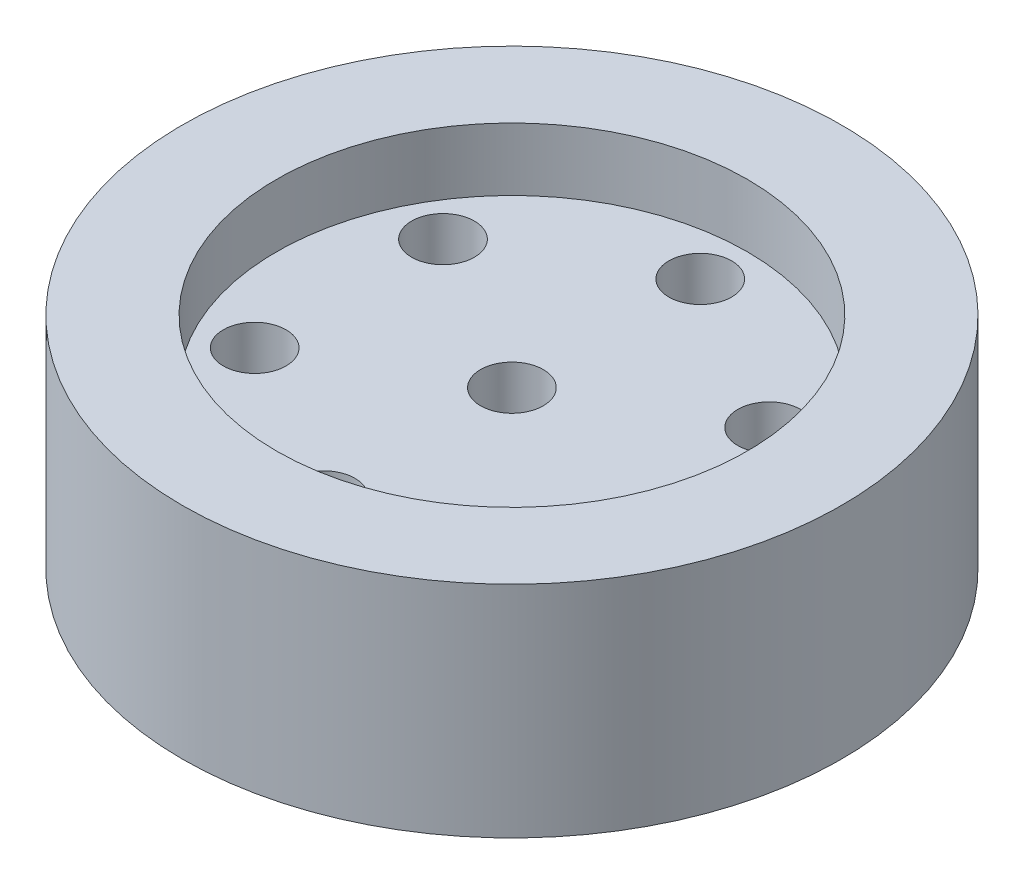
ISO-10303-21;
HEADER;
FILE_DESCRIPTION(('STEP AP214'),'2;1');
FILE_NAME('part.step','',(''),(''),'','','');
FILE_SCHEMA(('AUTOMOTIVE_DESIGN { 1 0 10303 214 1 1 1 1 }'));
ENDSEC;
DATA;
#1=APPLICATION_CONTEXT('core data for automotive mechanical design processes');
#2=APPLICATION_PROTOCOL_DEFINITION('international standard','automotive_design',2000,#1);
#3=PRODUCT_CONTEXT('',#1,'mechanical');
#4=PRODUCT('Part','Part','',(#3));
#5=PRODUCT_RELATED_PRODUCT_CATEGORY('part','',(#4));
#6=PRODUCT_DEFINITION_FORMATION('','',#4);
#7=PRODUCT_DEFINITION_CONTEXT('part definition',#1,'design');
#8=PRODUCT_DEFINITION('design','',#6,#7);
#9=PRODUCT_DEFINITION_SHAPE('','',#8);
#10=(LENGTH_UNIT() NAMED_UNIT(*) SI_UNIT(.MILLI.,.METRE.));
#11=(NAMED_UNIT(*) PLANE_ANGLE_UNIT() SI_UNIT($,.RADIAN.));
#12=(NAMED_UNIT(*) SI_UNIT($,.STERADIAN.) SOLID_ANGLE_UNIT());
#13=UNCERTAINTY_MEASURE_WITH_UNIT(LENGTH_MEASURE(1.E-05),#10,'distance_accuracy_value','');
#14=(GEOMETRIC_REPRESENTATION_CONTEXT(3) GLOBAL_UNCERTAINTY_ASSIGNED_CONTEXT((#13)) GLOBAL_UNIT_ASSIGNED_CONTEXT((#10,
#11,#12)) REPRESENTATION_CONTEXT('',''));
#15=CARTESIAN_POINT('',(0.,0.,0.));
#16=DIRECTION('',(0.,0.,1.));
#17=DIRECTION('',(1.,0.,0.));
#18=AXIS2_PLACEMENT_3D('',#15,#16,#17);
#19=CARTESIAN_POINT('',(0.,7.,0.));
#20=DIRECTION('',(0.,-1.,0.));
#21=DIRECTION('',(0.,0.,-1.));
#22=AXIS2_PLACEMENT_3D('',#19,#20,#21);
#23=CYLINDRICAL_SURFACE('',#22,21.);
#24=CARTESIAN_POINT('',(0.,7.,0.));
#25=DIRECTION('',(0.,1.,0.));
#26=DIRECTION('',(0.,0.,1.));
#27=AXIS2_PLACEMENT_3D('',#24,#25,#26);
#28=CIRCLE('',#27,21.);
#29=CARTESIAN_POINT('',(0.,7.,21.));
#30=VERTEX_POINT('',#29);
#31=EDGE_CURVE('E10',#30,#30,#28,.T.);
#32=ORIENTED_EDGE('',*,*,#31,.F.);
#33=EDGE_LOOP('',(#32));
#34=FACE_BOUND('',#33,.T.);
#35=CARTESIAN_POINT('',(0.,-7.,0.));
#36=DIRECTION('',(0.,1.,0.));
#37=DIRECTION('',(0.,0.,1.));
#38=AXIS2_PLACEMENT_3D('',#35,#36,#37);
#39=CIRCLE('',#38,21.);
#40=CARTESIAN_POINT('',(0.,-7.,21.));
#41=VERTEX_POINT('',#40);
#42=EDGE_CURVE('E38',#41,#41,#39,.T.);
#43=ORIENTED_EDGE('',*,*,#42,.T.);
#44=EDGE_LOOP('',(#43));
#45=FACE_BOUND('',#44,.T.);
#46=ADVANCED_FACE('F35',(#34,#45),#23,.T.);
#47=CARTESIAN_POINT('',(0.,7.,0.));
#48=DIRECTION('',(0.,1.,0.));
#49=DIRECTION('',(0.,0.,1.));
#50=AXIS2_PLACEMENT_3D('',#47,#48,#49);
#51=PLANE('',#50);
#52=CARTESIAN_POINT('',(0.,7.,0.));
#53=DIRECTION('',(0.,1.,0.));
#54=DIRECTION('',(0.,0.,1.));
#55=AXIS2_PLACEMENT_3D('',#52,#53,#54);
#56=CIRCLE('',#55,15.);
#57=CARTESIAN_POINT('',(0.,7.,15.));
#58=VERTEX_POINT('',#57);
#59=EDGE_CURVE('E47',#58,#58,#56,.T.);
#60=ORIENTED_EDGE('',*,*,#59,.F.);
#61=EDGE_LOOP('',(#60));
#62=FACE_BOUND('',#61,.T.);
#63=ORIENTED_EDGE('',*,*,#31,.T.);
#64=EDGE_LOOP('',(#63));
#65=FACE_BOUND('',#64,.T.);
#66=ADVANCED_FACE('F139',(#62,#65),#51,.T.);
#67=CARTESIAN_POINT('',(0.,-7.,0.));
#68=DIRECTION('',(0.,1.,0.));
#69=DIRECTION('',(0.,0.,1.));
#70=AXIS2_PLACEMENT_3D('',#67,#68,#69);
#71=PLANE('',#70);
#72=CARTESIAN_POINT('',(0.,-7.,0.));
#73=DIRECTION('',(0.,-1.,0.));
#74=DIRECTION('',(0.,0.,-1.));
#75=AXIS2_PLACEMENT_3D('',#72,#73,#74);
#76=CIRCLE('',#75,19.);
#77=CARTESIAN_POINT('',(0.,-7.,-19.));
#78=VERTEX_POINT('',#77);
#79=EDGE_CURVE('E53',#78,#78,#76,.T.);
#80=ORIENTED_EDGE('',*,*,#79,.F.);
#81=EDGE_LOOP('',(#80));
#82=FACE_BOUND('',#81,.T.);
#83=ORIENTED_EDGE('',*,*,#42,.F.);
#84=EDGE_LOOP('',(#83));
#85=FACE_BOUND('',#84,.T.);
#86=ADVANCED_FACE('F135',(#82,#85),#71,.F.);
#87=CARTESIAN_POINT('',(0.,3.,0.));
#88=DIRECTION('',(0.,1.,0.));
#89=DIRECTION('',(0.,0.,1.));
#90=AXIS2_PLACEMENT_3D('',#87,#88,#89);
#91=CYLINDRICAL_SURFACE('',#90,15.);
#92=CARTESIAN_POINT('',(0.,3.,0.));
#93=DIRECTION('',(0.,1.,0.));
#94=DIRECTION('',(0.,0.,1.));
#95=AXIS2_PLACEMENT_3D('',#92,#93,#94);
#96=CIRCLE('',#95,15.);
#97=CARTESIAN_POINT('',(0.,3.,15.));
#98=VERTEX_POINT('',#97);
#99=EDGE_CURVE('E45',#98,#98,#96,.T.);
#100=ORIENTED_EDGE('',*,*,#99,.F.);
#101=EDGE_LOOP('',(#100));
#102=FACE_BOUND('',#101,.T.);
#103=ORIENTED_EDGE('',*,*,#59,.T.);
#104=EDGE_LOOP('',(#103));
#105=FACE_BOUND('',#104,.T.);
#106=ADVANCED_FACE('F138',(#102,#105),#91,.F.);
#107=CARTESIAN_POINT('',(0.,3.,0.));
#108=DIRECTION('',(0.,1.,0.));
#109=DIRECTION('',(0.,0.,1.));
#110=AXIS2_PLACEMENT_3D('',#107,#108,#109);
#111=PLANE('',#110);
#112=CARTESIAN_POINT('',(0.,3.,12.));
#113=DIRECTION('',(0.,1.,0.));
#114=DIRECTION('',(0.,0.,1.));
#115=AXIS2_PLACEMENT_3D('',#112,#113,#114);
#116=CIRCLE('',#115,2.);
#117=CARTESIAN_POINT('',(0.,3.,14.));
#118=VERTEX_POINT('',#117);
#119=EDGE_CURVE('E70',#118,#118,#116,.T.);
#120=ORIENTED_EDGE('',*,*,#119,.F.);
#121=EDGE_LOOP('',(#120));
#122=FACE_BOUND('',#121,.T.);
#123=CARTESIAN_POINT('',(-10.3923048454131,3.,5.9999999999997));
#124=DIRECTION('',(0.,1.,0.));
#125=DIRECTION('',(0.,0.,1.));
#126=AXIS2_PLACEMENT_3D('',#123,#124,#125);
#127=CIRCLE('',#126,2.00000000000039);
#128=CARTESIAN_POINT('',(-10.3923048454131,3.,8.00000000000009));
#129=VERTEX_POINT('',#128);
#130=EDGE_CURVE('E73',#129,#129,#127,.T.);
#131=ORIENTED_EDGE('',*,*,#130,.F.);
#132=EDGE_LOOP('',(#131));
#133=FACE_BOUND('',#132,.T.);
#134=CARTESIAN_POINT('',(-10.3923048454128,3.,-6.0000000000003));
#135=DIRECTION('',(0.,1.,0.));
#136=DIRECTION('',(0.,0.,1.));
#137=AXIS2_PLACEMENT_3D('',#134,#135,#136);
#138=CIRCLE('',#137,2.00000000000068);
#139=CARTESIAN_POINT('',(-10.3923048454128,3.,-3.99999999999962));
#140=VERTEX_POINT('',#139);
#141=EDGE_CURVE('E76',#140,#140,#138,.T.);
#142=ORIENTED_EDGE('',*,*,#141,.F.);
#143=EDGE_LOOP('',(#142));
#144=FACE_BOUND('',#143,.T.);
#145=CARTESIAN_POINT('',(6.77712297852766E-13,3.,-12.));
#146=DIRECTION('',(0.,1.,0.));
#147=DIRECTION('',(0.,0.,1.));
#148=AXIS2_PLACEMENT_3D('',#145,#146,#147);
#149=CIRCLE('',#148,2.00000000000073);
#150=CARTESIAN_POINT('',(6.77712297852766E-13,3.,-9.99999999999927));
#151=VERTEX_POINT('',#150);
#152=EDGE_CURVE('E79',#151,#151,#149,.T.);
#153=ORIENTED_EDGE('',*,*,#152,.F.);
#154=EDGE_LOOP('',(#153));
#155=FACE_BOUND('',#154,.T.);
#156=CARTESIAN_POINT('',(10.3923048454138,3.,-5.99999999999971));
#157=DIRECTION('',(0.,1.,0.));
#158=DIRECTION('',(0.,0.,1.));
#159=AXIS2_PLACEMENT_3D('',#156,#157,#158);
#160=CIRCLE('',#159,2.00000000000046);
#161=CARTESIAN_POINT('',(10.3923048454138,3.,-3.99999999999925));
#162=VERTEX_POINT('',#161);
#163=EDGE_CURVE('E82',#162,#162,#160,.T.);
#164=ORIENTED_EDGE('',*,*,#163,.F.);
#165=EDGE_LOOP('',(#164));
#166=FACE_BOUND('',#165,.T.);
#167=CARTESIAN_POINT('',(10.3923048454134,3.,6.0000000000003));
#168=DIRECTION('',(0.,1.,0.));
#169=DIRECTION('',(0.,0.,1.));
#170=AXIS2_PLACEMENT_3D('',#167,#168,#169);
#171=CIRCLE('',#170,2.00000000000011);
#172=CARTESIAN_POINT('',(10.3923048454134,3.,8.00000000000041));
#173=VERTEX_POINT('',#172);
#174=EDGE_CURVE('E85',#173,#173,#171,.T.);
#175=ORIENTED_EDGE('',*,*,#174,.F.);
#176=EDGE_LOOP('',(#175));
#177=FACE_BOUND('',#176,.T.);
#178=CARTESIAN_POINT('',(0.,3.,0.));
#179=DIRECTION('',(0.,1.,0.));
#180=DIRECTION('',(0.,0.,1.));
#181=AXIS2_PLACEMENT_3D('',#178,#179,#180);
#182=CIRCLE('',#181,2.);
#183=CARTESIAN_POINT('',(0.,3.,2.));
#184=VERTEX_POINT('',#183);
#185=EDGE_CURVE('E62',#184,#184,#182,.T.);
#186=ORIENTED_EDGE('',*,*,#185,.F.);
#187=EDGE_LOOP('',(#186));
#188=FACE_BOUND('',#187,.T.);
#189=ORIENTED_EDGE('',*,*,#99,.T.);
#190=EDGE_LOOP('',(#189));
#191=FACE_BOUND('',#190,.T.);
#192=ADVANCED_FACE('F131',(#122,#133,#144,#155,#166,#177,#188,#191),#111,.T.);
#193=CARTESIAN_POINT('',(0.,-3.,0.));
#194=DIRECTION('',(0.,-1.,0.));
#195=DIRECTION('',(0.,0.,-1.));
#196=AXIS2_PLACEMENT_3D('',#193,#194,#195);
#197=CYLINDRICAL_SURFACE('',#196,19.);
#198=CARTESIAN_POINT('',(0.,-3.,0.));
#199=DIRECTION('',(0.,-1.,0.));
#200=DIRECTION('',(0.,0.,-1.));
#201=AXIS2_PLACEMENT_3D('',#198,#199,#200);
#202=CIRCLE('',#201,19.);
#203=CARTESIAN_POINT('',(0.,-3.,-19.));
#204=VERTEX_POINT('',#203);
#205=EDGE_CURVE('E50',#204,#204,#202,.T.);
#206=ORIENTED_EDGE('',*,*,#205,.F.);
#207=EDGE_LOOP('',(#206));
#208=FACE_BOUND('',#207,.T.);
#209=ORIENTED_EDGE('',*,*,#79,.T.);
#210=EDGE_LOOP('',(#209));
#211=FACE_BOUND('',#210,.T.);
#212=ADVANCED_FACE('F113',(#208,#211),#197,.F.);
#213=CARTESIAN_POINT('',(0.,-3.,0.));
#214=DIRECTION('',(0.,-1.,0.));
#215=DIRECTION('',(0.,0.,-1.));
#216=AXIS2_PLACEMENT_3D('',#213,#214,#215);
#217=PLANE('',#216);
#218=CARTESIAN_POINT('',(0.,-3.,12.));
#219=DIRECTION('',(0.,-1.,0.));
#220=DIRECTION('',(0.,0.,-1.));
#221=AXIS2_PLACEMENT_3D('',#218,#219,#220);
#222=CIRCLE('',#221,2.);
#223=CARTESIAN_POINT('',(0.,-3.,10.));
#224=VERTEX_POINT('',#223);
#225=EDGE_CURVE('E88',#224,#224,#222,.T.);
#226=ORIENTED_EDGE('',*,*,#225,.F.);
#227=EDGE_LOOP('',(#226));
#228=FACE_BOUND('',#227,.T.);
#229=CARTESIAN_POINT('',(-10.3923048454131,-3.,5.9999999999997));
#230=DIRECTION('',(0.,-1.,0.));
#231=DIRECTION('',(0.,0.,-1.));
#232=AXIS2_PLACEMENT_3D('',#229,#230,#231);
#233=CIRCLE('',#232,2.00000000000039);
#234=CARTESIAN_POINT('',(-10.3923048454131,-3.,3.99999999999931));
#235=VERTEX_POINT('',#234);
#236=EDGE_CURVE('E93',#235,#235,#233,.T.);
#237=ORIENTED_EDGE('',*,*,#236,.F.);
#238=EDGE_LOOP('',(#237));
#239=FACE_BOUND('',#238,.T.);
#240=CARTESIAN_POINT('',(-10.3923048454128,-3.,-6.0000000000003));
#241=DIRECTION('',(0.,-1.,0.));
#242=DIRECTION('',(0.,0.,-1.));
#243=AXIS2_PLACEMENT_3D('',#240,#241,#242);
#244=CIRCLE('',#243,2.00000000000068);
#245=CARTESIAN_POINT('',(-10.3923048454128,-3.,-8.00000000000098));
#246=VERTEX_POINT('',#245);
#247=EDGE_CURVE('E89',#246,#246,#244,.T.);
#248=ORIENTED_EDGE('',*,*,#247,.F.);
#249=EDGE_LOOP('',(#248));
#250=FACE_BOUND('',#249,.T.);
#251=CARTESIAN_POINT('',(6.77712297852766E-13,-3.,-12.));
#252=DIRECTION('',(0.,-1.,0.));
#253=DIRECTION('',(0.,0.,-1.));
#254=AXIS2_PLACEMENT_3D('',#251,#252,#253);
#255=CIRCLE('',#254,2.00000000000073);
#256=CARTESIAN_POINT('',(6.77712297852766E-13,-3.,-14.0000000000007));
#257=VERTEX_POINT('',#256);
#258=EDGE_CURVE('E92',#257,#257,#255,.T.);
#259=ORIENTED_EDGE('',*,*,#258,.F.);
#260=EDGE_LOOP('',(#259));
#261=FACE_BOUND('',#260,.T.);
#262=CARTESIAN_POINT('',(10.3923048454138,-3.,-5.99999999999971));
#263=DIRECTION('',(0.,-1.,0.));
#264=DIRECTION('',(0.,0.,-1.));
#265=AXIS2_PLACEMENT_3D('',#262,#263,#264);
#266=CIRCLE('',#265,2.00000000000046);
#267=CARTESIAN_POINT('',(10.3923048454138,-3.,-8.00000000000016));
#268=VERTEX_POINT('',#267);
#269=EDGE_CURVE('E96',#268,#268,#266,.T.);
#270=ORIENTED_EDGE('',*,*,#269,.F.);
#271=EDGE_LOOP('',(#270));
#272=FACE_BOUND('',#271,.T.);
#273=CARTESIAN_POINT('',(10.3923048454134,-3.,6.0000000000003));
#274=DIRECTION('',(0.,-1.,0.));
#275=DIRECTION('',(0.,0.,-1.));
#276=AXIS2_PLACEMENT_3D('',#273,#274,#275);
#277=CIRCLE('',#276,2.00000000000011);
#278=CARTESIAN_POINT('',(10.3923048454134,-3.,4.00000000000019));
#279=VERTEX_POINT('',#278);
#280=EDGE_CURVE('E99',#279,#279,#277,.T.);
#281=ORIENTED_EDGE('',*,*,#280,.F.);
#282=EDGE_LOOP('',(#281));
#283=FACE_BOUND('',#282,.T.);
#284=CARTESIAN_POINT('',(0.,-3.,0.));
#285=DIRECTION('',(0.,-1.,0.));
#286=DIRECTION('',(0.,0.,-1.));
#287=AXIS2_PLACEMENT_3D('',#284,#285,#286);
#288=CIRCLE('',#287,5.);
#289=CARTESIAN_POINT('',(0.,-3.,-5.));
#290=VERTEX_POINT('',#289);
#291=EDGE_CURVE('E56',#290,#290,#288,.T.);
#292=ORIENTED_EDGE('',*,*,#291,.F.);
#293=EDGE_LOOP('',(#292));
#294=FACE_BOUND('',#293,.T.);
#295=ORIENTED_EDGE('',*,*,#205,.T.);
#296=EDGE_LOOP('',(#295));
#297=FACE_BOUND('',#296,.T.);
#298=ADVANCED_FACE('F109',(#228,#239,#250,#261,#272,#283,#294,#297),#217,.T.);
#299=CARTESIAN_POINT('',(0.,-3.,0.));
#300=DIRECTION('',(0.,-1.,0.));
#301=DIRECTION('',(0.,0.,-1.));
#302=AXIS2_PLACEMENT_3D('',#299,#300,#301);
#303=CYLINDRICAL_SURFACE('',#302,5.);
#304=ORIENTED_EDGE('',*,*,#291,.T.);
#305=EDGE_LOOP('',(#304));
#306=FACE_BOUND('',#305,.T.);
#307=CARTESIAN_POINT('',(0.,-7.,0.));
#308=DIRECTION('',(0.,-1.,0.));
#309=DIRECTION('',(0.,0.,-1.));
#310=AXIS2_PLACEMENT_3D('',#307,#308,#309);
#311=CIRCLE('',#310,5.);
#312=CARTESIAN_POINT('',(0.,-7.,-5.));
#313=VERTEX_POINT('',#312);
#314=EDGE_CURVE('E59',#313,#313,#311,.T.);
#315=ORIENTED_EDGE('',*,*,#314,.F.);
#316=EDGE_LOOP('',(#315));
#317=FACE_BOUND('',#316,.T.);
#318=ADVANCED_FACE('F112',(#306,#317),#303,.T.);
#319=CARTESIAN_POINT('',(0.,-7.,0.));
#320=DIRECTION('',(0.,-1.,0.));
#321=DIRECTION('',(0.,0.,-1.));
#322=AXIS2_PLACEMENT_3D('',#319,#320,#321);
#323=CIRCLE('',#322,2.);
#324=CARTESIAN_POINT('',(0.,-7.,-2.));
#325=VERTEX_POINT('',#324);
#326=EDGE_CURVE('E67',#325,#325,#323,.T.);
#327=ORIENTED_EDGE('',*,*,#326,.F.);
#328=EDGE_LOOP('',(#327));
#329=FACE_BOUND('',#328,.T.);
#330=ORIENTED_EDGE('',*,*,#314,.T.);
#331=EDGE_LOOP('',(#330));
#332=FACE_BOUND('',#331,.T.);
#333=ADVANCED_FACE('F140',(#329,#332),#71,.F.);
#334=CARTESIAN_POINT('',(0.,7.,0.));
#335=DIRECTION('',(0.,-1.,0.));
#336=DIRECTION('',(0.,0.,-1.));
#337=AXIS2_PLACEMENT_3D('',#334,#335,#336);
#338=CYLINDRICAL_SURFACE('',#337,2.);
#339=ORIENTED_EDGE('',*,*,#185,.T.);
#340=EDGE_LOOP('',(#339));
#341=FACE_BOUND('',#340,.T.);
#342=ORIENTED_EDGE('',*,*,#326,.T.);
#343=EDGE_LOOP('',(#342));
#344=FACE_BOUND('',#343,.T.);
#345=ADVANCED_FACE('F163',(#341,#344),#338,.F.);
#346=CARTESIAN_POINT('',(10.3923048454134,7.,6.0000000000003));
#347=DIRECTION('',(0.,-1.,0.));
#348=DIRECTION('',(0.,0.,-1.));
#349=AXIS2_PLACEMENT_3D('',#346,#347,#348);
#350=CYLINDRICAL_SURFACE('',#349,2.00000000000011);
#351=ORIENTED_EDGE('',*,*,#174,.T.);
#352=EDGE_LOOP('',(#351));
#353=FACE_BOUND('',#352,.T.);
#354=ORIENTED_EDGE('',*,*,#280,.T.);
#355=EDGE_LOOP('',(#354));
#356=FACE_BOUND('',#355,.T.);
#357=ADVANCED_FACE('F166',(#353,#356),#350,.F.);
#358=CARTESIAN_POINT('',(10.3923048454138,7.,-5.99999999999971));
#359=DIRECTION('',(0.,-1.,0.));
#360=DIRECTION('',(0.,0.,-1.));
#361=AXIS2_PLACEMENT_3D('',#358,#359,#360);
#362=CYLINDRICAL_SURFACE('',#361,2.00000000000046);
#363=ORIENTED_EDGE('',*,*,#163,.T.);
#364=EDGE_LOOP('',(#363));
#365=FACE_BOUND('',#364,.T.);
#366=ORIENTED_EDGE('',*,*,#269,.T.);
#367=EDGE_LOOP('',(#366));
#368=FACE_BOUND('',#367,.T.);
#369=ADVANCED_FACE('F176',(#365,#368),#362,.F.);
#370=CARTESIAN_POINT('',(6.77712297852766E-13,7.,-12.));
#371=DIRECTION('',(0.,-1.,0.));
#372=DIRECTION('',(0.,0.,-1.));
#373=AXIS2_PLACEMENT_3D('',#370,#371,#372);
#374=CYLINDRICAL_SURFACE('',#373,2.00000000000073);
#375=ORIENTED_EDGE('',*,*,#152,.T.);
#376=EDGE_LOOP('',(#375));
#377=FACE_BOUND('',#376,.T.);
#378=ORIENTED_EDGE('',*,*,#258,.T.);
#379=EDGE_LOOP('',(#378));
#380=FACE_BOUND('',#379,.T.);
#381=ADVANCED_FACE('F172',(#377,#380),#374,.F.);
#382=CARTESIAN_POINT('',(-10.3923048454128,7.,-6.0000000000003));
#383=DIRECTION('',(0.,-1.,0.));
#384=DIRECTION('',(0.,0.,-1.));
#385=AXIS2_PLACEMENT_3D('',#382,#383,#384);
#386=CYLINDRICAL_SURFACE('',#385,2.00000000000068);
#387=ORIENTED_EDGE('',*,*,#141,.T.);
#388=EDGE_LOOP('',(#387));
#389=FACE_BOUND('',#388,.T.);
#390=ORIENTED_EDGE('',*,*,#247,.T.);
#391=EDGE_LOOP('',(#390));
#392=FACE_BOUND('',#391,.T.);
#393=ADVANCED_FACE('F168',(#389,#392),#386,.F.);
#394=CARTESIAN_POINT('',(-10.3923048454131,7.,5.9999999999997));
#395=DIRECTION('',(0.,-1.,0.));
#396=DIRECTION('',(0.,0.,-1.));
#397=AXIS2_PLACEMENT_3D('',#394,#395,#396);
#398=CYLINDRICAL_SURFACE('',#397,2.00000000000039);
#399=ORIENTED_EDGE('',*,*,#130,.T.);
#400=EDGE_LOOP('',(#399));
#401=FACE_BOUND('',#400,.T.);
#402=ORIENTED_EDGE('',*,*,#236,.T.);
#403=EDGE_LOOP('',(#402));
#404=FACE_BOUND('',#403,.T.);
#405=ADVANCED_FACE('F171',(#401,#404),#398,.F.);
#406=CARTESIAN_POINT('',(0.,7.,12.));
#407=DIRECTION('',(0.,-1.,0.));
#408=DIRECTION('',(0.,0.,-1.));
#409=AXIS2_PLACEMENT_3D('',#406,#407,#408);
#410=CYLINDRICAL_SURFACE('',#409,2.);
#411=ORIENTED_EDGE('',*,*,#119,.T.);
#412=EDGE_LOOP('',(#411));
#413=FACE_BOUND('',#412,.T.);
#414=ORIENTED_EDGE('',*,*,#225,.T.);
#415=EDGE_LOOP('',(#414));
#416=FACE_BOUND('',#415,.T.);
#417=ADVANCED_FACE('F107',(#413,#416),#410,.F.);
#418=CLOSED_SHELL('',(#46,#66,#86,#106,#192,#212,#298,#318,#333,#345,#357,#369,#381,#393,#405,#417));
#419=MANIFOLD_SOLID_BREP('B2',#418);
#420=ADVANCED_BREP_SHAPE_REPRESENTATION('',(#18,#419),#14);
#421=SHAPE_DEFINITION_REPRESENTATION(#9,#420);
ENDSEC;
END-ISO-10303-21;
